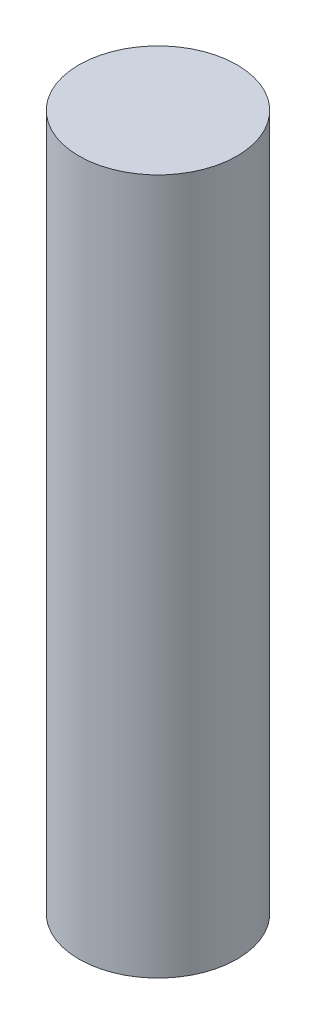
ISO-10303-21;
HEADER;
FILE_DESCRIPTION(('STEP AP214'),'2;1');
FILE_NAME('part.step','',(''),(''),'','','');
FILE_SCHEMA(('AUTOMOTIVE_DESIGN { 1 0 10303 214 1 1 1 1 }'));
ENDSEC;
DATA;
#1=APPLICATION_CONTEXT('core data for automotive mechanical design processes');
#2=APPLICATION_PROTOCOL_DEFINITION('international standard','automotive_design',2000,#1);
#3=PRODUCT_CONTEXT('',#1,'mechanical');
#4=PRODUCT('Part','Part','',(#3));
#5=PRODUCT_RELATED_PRODUCT_CATEGORY('part','',(#4));
#6=PRODUCT_DEFINITION_FORMATION('','',#4);
#7=PRODUCT_DEFINITION_CONTEXT('part definition',#1,'design');
#8=PRODUCT_DEFINITION('design','',#6,#7);
#9=PRODUCT_DEFINITION_SHAPE('','',#8);
#10=(LENGTH_UNIT() NAMED_UNIT(*) SI_UNIT(.MILLI.,.METRE.));
#11=(NAMED_UNIT(*) PLANE_ANGLE_UNIT() SI_UNIT($,.RADIAN.));
#12=(NAMED_UNIT(*) SI_UNIT($,.STERADIAN.) SOLID_ANGLE_UNIT());
#13=UNCERTAINTY_MEASURE_WITH_UNIT(LENGTH_MEASURE(1.E-05),#10,'distance_accuracy_value','');
#14=(GEOMETRIC_REPRESENTATION_CONTEXT(3) GLOBAL_UNCERTAINTY_ASSIGNED_CONTEXT((#13)) GLOBAL_UNIT_ASSIGNED_CONTEXT((#10,
#11,#12)) REPRESENTATION_CONTEXT('',''));
#15=CARTESIAN_POINT('',(0.,0.,0.));
#16=DIRECTION('',(0.,0.,1.));
#17=DIRECTION('',(1.,0.,0.));
#18=AXIS2_PLACEMENT_3D('',#15,#16,#17);
#19=CARTESIAN_POINT('',(0.,44.,0.));
#20=DIRECTION('',(0.,-1.,0.));
#21=DIRECTION('',(0.,0.,-1.));
#22=AXIS2_PLACEMENT_3D('',#19,#20,#21);
#23=CYLINDRICAL_SURFACE('',#22,5.);
#24=CARTESIAN_POINT('',(0.,44.,0.));
#25=DIRECTION('',(0.,1.,0.));
#26=DIRECTION('',(0.,0.,1.));
#27=AXIS2_PLACEMENT_3D('',#24,#25,#26);
#28=CIRCLE('',#27,5.);
#29=CARTESIAN_POINT('',(0.,44.,5.));
#30=VERTEX_POINT('',#29);
#31=EDGE_CURVE('E10',#30,#30,#28,.T.);
#32=ORIENTED_EDGE('',*,*,#31,.F.);
#33=EDGE_LOOP('',(#32));
#34=FACE_BOUND('',#33,.T.);
#35=CARTESIAN_POINT('',(0.,0.,0.));
#36=DIRECTION('',(0.,1.,0.));
#37=DIRECTION('',(0.,0.,1.));
#38=AXIS2_PLACEMENT_3D('',#35,#36,#37);
#39=CIRCLE('',#38,5.);
#40=CARTESIAN_POINT('',(0.,0.,5.));
#41=VERTEX_POINT('',#40);
#42=EDGE_CURVE('E40',#41,#41,#39,.T.);
#43=ORIENTED_EDGE('',*,*,#42,.T.);
#44=EDGE_LOOP('',(#43));
#45=FACE_BOUND('',#44,.T.);
#46=ADVANCED_FACE('F37',(#34,#45),#23,.T.);
#47=CARTESIAN_POINT('',(0.,44.,0.));
#48=DIRECTION('',(0.,1.,0.));
#49=DIRECTION('',(0.,0.,1.));
#50=AXIS2_PLACEMENT_3D('',#47,#48,#49);
#51=PLANE('',#50);
#52=ORIENTED_EDGE('',*,*,#31,.T.);
#53=EDGE_LOOP('',(#52));
#54=FACE_BOUND('',#53,.T.);
#55=ADVANCED_FACE('F54',(#54),#51,.T.);
#56=CARTESIAN_POINT('',(0.,0.,0.));
#57=DIRECTION('',(0.,1.,0.));
#58=DIRECTION('',(0.,0.,1.));
#59=AXIS2_PLACEMENT_3D('',#56,#57,#58);
#60=PLANE('',#59);
#61=ORIENTED_EDGE('',*,*,#42,.F.);
#62=EDGE_LOOP('',(#61));
#63=FACE_BOUND('',#62,.T.);
#64=ADVANCED_FACE('F52',(#63),#60,.F.);
#65=CLOSED_SHELL('',(#46,#55,#64));
#66=MANIFOLD_SOLID_BREP('B2',#65);
#67=ADVANCED_BREP_SHAPE_REPRESENTATION('',(#18,#66),#14);
#68=SHAPE_DEFINITION_REPRESENTATION(#9,#67);
ENDSEC;
END-ISO-10303-21;
